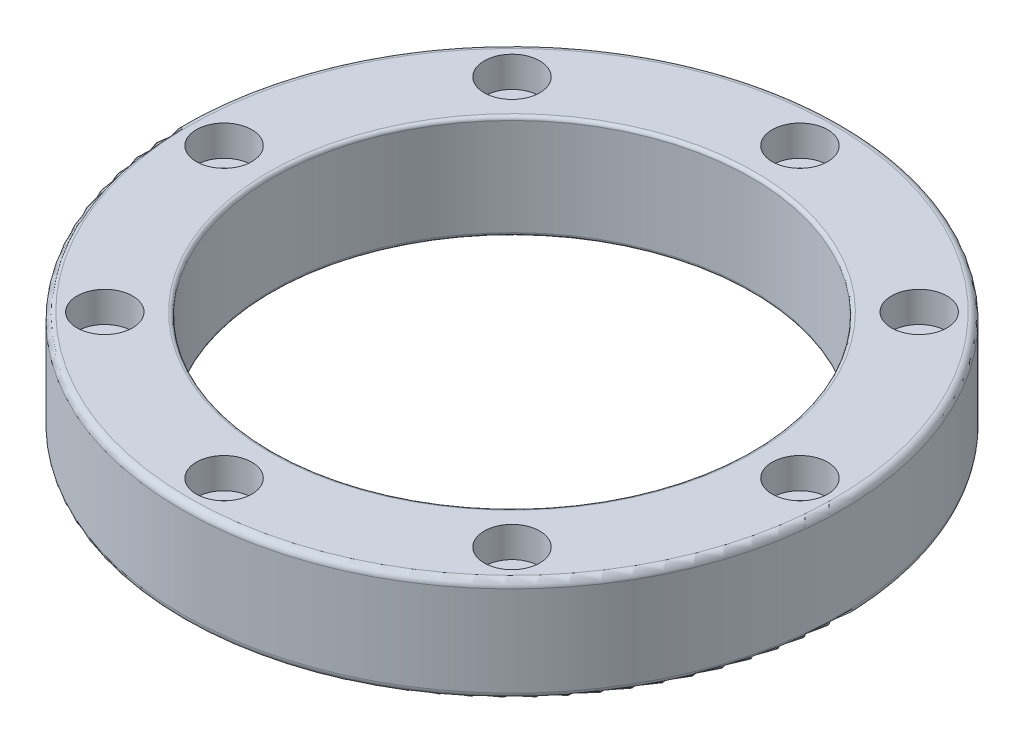
ISO-10303-21;
HEADER;
FILE_DESCRIPTION(('STEP AP214'),'2;1');
FILE_NAME('part.step','',(''),(''),'','','');
FILE_SCHEMA(('AUTOMOTIVE_DESIGN { 1 0 10303 214 1 1 1 1 }'));
ENDSEC;
DATA;
#1=APPLICATION_CONTEXT('core data for automotive mechanical design processes');
#2=APPLICATION_PROTOCOL_DEFINITION('international standard','automotive_design',2000,#1);
#3=PRODUCT_CONTEXT('',#1,'mechanical');
#4=PRODUCT('Part','Part','',(#3));
#5=PRODUCT_RELATED_PRODUCT_CATEGORY('part','',(#4));
#6=PRODUCT_DEFINITION_FORMATION('','',#4);
#7=PRODUCT_DEFINITION_CONTEXT('part definition',#1,'design');
#8=PRODUCT_DEFINITION('design','',#6,#7);
#9=PRODUCT_DEFINITION_SHAPE('','',#8);
#10=(LENGTH_UNIT() NAMED_UNIT(*) SI_UNIT(.MILLI.,.METRE.));
#11=(NAMED_UNIT(*) PLANE_ANGLE_UNIT() SI_UNIT($,.RADIAN.));
#12=(NAMED_UNIT(*) SI_UNIT($,.STERADIAN.) SOLID_ANGLE_UNIT());
#13=UNCERTAINTY_MEASURE_WITH_UNIT(LENGTH_MEASURE(1.E-05),#10,'distance_accuracy_value','');
#14=(GEOMETRIC_REPRESENTATION_CONTEXT(3) GLOBAL_UNCERTAINTY_ASSIGNED_CONTEXT((#13)) GLOBAL_UNIT_ASSIGNED_CONTEXT((#10,
#11,#12)) REPRESENTATION_CONTEXT('',''));
#15=CARTESIAN_POINT('',(0.,0.,0.));
#16=DIRECTION('',(0.,0.,1.));
#17=DIRECTION('',(1.,0.,0.));
#18=AXIS2_PLACEMENT_3D('',#15,#16,#17);
#19=CARTESIAN_POINT('',(-29.3449314192414,0.,-29.3449314192421));
#20=DIRECTION('',(0.,1.,0.));
#21=DIRECTION('',(0.,0.,1.));
#22=AXIS2_PLACEMENT_3D('',#19,#20,#21);
#23=CYLINDRICAL_SURFACE('',#22,2.25);
#24=CARTESIAN_POINT('',(-29.3449314192414,0.,-29.3449314192421));
#25=DIRECTION('',(0.,1.,0.));
#26=DIRECTION('',(0.,0.,1.));
#27=AXIS2_PLACEMENT_3D('',#24,#25,#26);
#28=CIRCLE('',#27,2.25);
#29=CARTESIAN_POINT('',(-29.3449314192414,0.,-27.0949314192421));
#30=VERTEX_POINT('',#29);
#31=EDGE_CURVE('E73',#30,#30,#28,.T.);
#32=ORIENTED_EDGE('',*,*,#31,.F.);
#33=EDGE_LOOP('',(#32));
#34=FACE_BOUND('',#33,.T.);
#35=CARTESIAN_POINT('',(-29.3449314192414,10.6,-29.3449314192421));
#36=DIRECTION('',(0.,1.,0.));
#37=DIRECTION('',(0.,0.,1.));
#38=AXIS2_PLACEMENT_3D('',#35,#36,#37);
#39=CIRCLE('',#38,2.25);
#40=CARTESIAN_POINT('',(-29.3449314192414,10.6,-27.0949314192421));
#41=VERTEX_POINT('',#40);
#42=EDGE_CURVE('E70',#41,#41,#39,.F.);
#43=ORIENTED_EDGE('',*,*,#42,.F.);
#44=EDGE_LOOP('',(#43));
#45=FACE_BOUND('',#44,.T.);
#46=ADVANCED_FACE('F37',(#34,#45),#23,.F.);
#47=CARTESIAN_POINT('',(-41.5,0.,-4.3468942668597E-13));
#48=DIRECTION('',(0.,1.,0.));
#49=DIRECTION('',(0.,0.,1.));
#50=AXIS2_PLACEMENT_3D('',#47,#48,#49);
#51=CYLINDRICAL_SURFACE('',#50,2.25);
#52=CARTESIAN_POINT('',(-41.5,0.,-4.3468942668597E-13));
#53=DIRECTION('',(0.,1.,0.));
#54=DIRECTION('',(0.,0.,1.));
#55=AXIS2_PLACEMENT_3D('',#52,#53,#54);
#56=CIRCLE('',#55,2.25);
#57=CARTESIAN_POINT('',(-41.5,0.,2.24999999999957));
#58=VERTEX_POINT('',#57);
#59=EDGE_CURVE('E98',#58,#58,#56,.T.);
#60=ORIENTED_EDGE('',*,*,#59,.F.);
#61=EDGE_LOOP('',(#60));
#62=FACE_BOUND('',#61,.T.);
#63=CARTESIAN_POINT('',(-41.5,10.6,-4.3468942668597E-13));
#64=DIRECTION('',(0.,1.,0.));
#65=DIRECTION('',(0.,0.,1.));
#66=AXIS2_PLACEMENT_3D('',#63,#64,#65);
#67=CIRCLE('',#66,2.25);
#68=CARTESIAN_POINT('',(-41.5,10.6,2.24999999999957));
#69=VERTEX_POINT('',#68);
#70=EDGE_CURVE('E74',#69,#69,#67,.F.);
#71=ORIENTED_EDGE('',*,*,#70,.F.);
#72=EDGE_LOOP('',(#71));
#73=FACE_BOUND('',#72,.T.);
#74=ADVANCED_FACE('F216',(#62,#73),#51,.F.);
#75=CARTESIAN_POINT('',(-29.344931419242,0.,29.3449314192415));
#76=DIRECTION('',(0.,1.,0.));
#77=DIRECTION('',(0.,0.,1.));
#78=AXIS2_PLACEMENT_3D('',#75,#76,#77);
#79=CYLINDRICAL_SURFACE('',#78,2.25);
#80=CARTESIAN_POINT('',(-29.344931419242,0.,29.3449314192415));
#81=DIRECTION('',(0.,1.,0.));
#82=DIRECTION('',(0.,0.,1.));
#83=AXIS2_PLACEMENT_3D('',#80,#81,#82);
#84=CIRCLE('',#83,2.25);
#85=CARTESIAN_POINT('',(-29.344931419242,0.,31.5949314192415));
#86=VERTEX_POINT('',#85);
#87=EDGE_CURVE('E101',#86,#86,#84,.T.);
#88=ORIENTED_EDGE('',*,*,#87,.F.);
#89=EDGE_LOOP('',(#88));
#90=FACE_BOUND('',#89,.T.);
#91=CARTESIAN_POINT('',(-29.344931419242,10.6,29.3449314192415));
#92=DIRECTION('',(0.,1.,0.));
#93=DIRECTION('',(0.,0.,1.));
#94=AXIS2_PLACEMENT_3D('',#91,#92,#93);
#95=CIRCLE('',#94,2.25);
#96=CARTESIAN_POINT('',(-29.344931419242,10.6,31.5949314192415));
#97=VERTEX_POINT('',#96);
#98=EDGE_CURVE('E77',#97,#97,#95,.F.);
#99=ORIENTED_EDGE('',*,*,#98,.F.);
#100=EDGE_LOOP('',(#99));
#101=FACE_BOUND('',#100,.T.);
#102=ADVANCED_FACE('F222',(#90,#101),#79,.F.);
#103=CARTESIAN_POINT('',(-2.8979295112398E-13,0.,41.5));
#104=DIRECTION('',(0.,1.,0.));
#105=DIRECTION('',(0.,0.,1.));
#106=AXIS2_PLACEMENT_3D('',#103,#104,#105);
#107=CYLINDRICAL_SURFACE('',#106,2.25);
#108=CARTESIAN_POINT('',(-2.8979295112398E-13,0.,41.5));
#109=DIRECTION('',(0.,1.,0.));
#110=DIRECTION('',(0.,0.,1.));
#111=AXIS2_PLACEMENT_3D('',#108,#109,#110);
#112=CIRCLE('',#111,2.25);
#113=CARTESIAN_POINT('',(-2.8979295112398E-13,0.,43.75));
#114=VERTEX_POINT('',#113);
#115=EDGE_CURVE('E104',#114,#114,#112,.T.);
#116=ORIENTED_EDGE('',*,*,#115,.F.);
#117=EDGE_LOOP('',(#116));
#118=FACE_BOUND('',#117,.T.);
#119=CARTESIAN_POINT('',(-2.8979295112398E-13,10.6,41.5));
#120=DIRECTION('',(0.,1.,0.));
#121=DIRECTION('',(0.,0.,1.));
#122=AXIS2_PLACEMENT_3D('',#119,#120,#121);
#123=CIRCLE('',#122,2.25);
#124=CARTESIAN_POINT('',(-2.8979295112398E-13,10.6,43.75));
#125=VERTEX_POINT('',#124);
#126=EDGE_CURVE('E80',#125,#125,#123,.F.);
#127=ORIENTED_EDGE('',*,*,#126,.F.);
#128=EDGE_LOOP('',(#127));
#129=FACE_BOUND('',#128,.T.);
#130=ADVANCED_FACE('F476',(#118,#129),#107,.F.);
#131=CARTESIAN_POINT('',(29.3449314192416,0.,29.3449314192419));
#132=DIRECTION('',(0.,1.,0.));
#133=DIRECTION('',(0.,0.,1.));
#134=AXIS2_PLACEMENT_3D('',#131,#132,#133);
#135=CYLINDRICAL_SURFACE('',#134,2.25);
#136=CARTESIAN_POINT('',(29.3449314192416,0.,29.3449314192419));
#137=DIRECTION('',(0.,1.,0.));
#138=DIRECTION('',(0.,0.,1.));
#139=AXIS2_PLACEMENT_3D('',#136,#137,#138);
#140=CIRCLE('',#139,2.25);
#141=CARTESIAN_POINT('',(29.3449314192416,0.,31.5949314192419));
#142=VERTEX_POINT('',#141);
#143=EDGE_CURVE('E107',#142,#142,#140,.T.);
#144=ORIENTED_EDGE('',*,*,#143,.F.);
#145=EDGE_LOOP('',(#144));
#146=FACE_BOUND('',#145,.T.);
#147=CARTESIAN_POINT('',(29.3449314192416,10.6,29.3449314192419));
#148=DIRECTION('',(0.,1.,0.));
#149=DIRECTION('',(0.,0.,1.));
#150=AXIS2_PLACEMENT_3D('',#147,#148,#149);
#151=CIRCLE('',#150,2.25);
#152=CARTESIAN_POINT('',(29.3449314192416,10.6,31.5949314192419));
#153=VERTEX_POINT('',#152);
#154=EDGE_CURVE('E83',#153,#153,#151,.F.);
#155=ORIENTED_EDGE('',*,*,#154,.F.);
#156=EDGE_LOOP('',(#155));
#157=FACE_BOUND('',#156,.T.);
#158=ADVANCED_FACE('F467',(#146,#157),#135,.F.);
#159=CARTESIAN_POINT('',(41.5,0.,1.4489647556199E-13));
#160=DIRECTION('',(0.,1.,0.));
#161=DIRECTION('',(0.,0.,1.));
#162=AXIS2_PLACEMENT_3D('',#159,#160,#161);
#163=CYLINDRICAL_SURFACE('',#162,2.25);
#164=CARTESIAN_POINT('',(41.5,0.,1.4489647556199E-13));
#165=DIRECTION('',(0.,1.,0.));
#166=DIRECTION('',(0.,0.,1.));
#167=AXIS2_PLACEMENT_3D('',#164,#165,#166);
#168=CIRCLE('',#167,2.25);
#169=CARTESIAN_POINT('',(41.5,0.,2.25000000000015));
#170=VERTEX_POINT('',#169);
#171=EDGE_CURVE('E110',#170,#170,#168,.T.);
#172=ORIENTED_EDGE('',*,*,#171,.F.);
#173=EDGE_LOOP('',(#172));
#174=FACE_BOUND('',#173,.T.);
#175=CARTESIAN_POINT('',(41.5,10.6,1.4489647556199E-13));
#176=DIRECTION('',(0.,1.,0.));
#177=DIRECTION('',(0.,0.,1.));
#178=AXIS2_PLACEMENT_3D('',#175,#176,#177);
#179=CIRCLE('',#178,2.25);
#180=CARTESIAN_POINT('',(41.5,10.6,2.25000000000015));
#181=VERTEX_POINT('',#180);
#182=EDGE_CURVE('E86',#181,#181,#179,.F.);
#183=ORIENTED_EDGE('',*,*,#182,.F.);
#184=EDGE_LOOP('',(#183));
#185=FACE_BOUND('',#184,.T.);
#186=ADVANCED_FACE('F458',(#174,#185),#163,.F.);
#187=CARTESIAN_POINT('',(29.3449314192418,0.,-29.3449314192417));
#188=DIRECTION('',(0.,1.,0.));
#189=DIRECTION('',(0.,0.,1.));
#190=AXIS2_PLACEMENT_3D('',#187,#188,#189);
#191=CYLINDRICAL_SURFACE('',#190,2.25);
#192=CARTESIAN_POINT('',(29.3449314192418,0.,-29.3449314192417));
#193=DIRECTION('',(0.,1.,0.));
#194=DIRECTION('',(0.,0.,1.));
#195=AXIS2_PLACEMENT_3D('',#192,#193,#194);
#196=CIRCLE('',#195,2.25);
#197=CARTESIAN_POINT('',(29.3449314192418,0.,-27.0949314192417));
#198=VERTEX_POINT('',#197);
#199=EDGE_CURVE('E113',#198,#198,#196,.T.);
#200=ORIENTED_EDGE('',*,*,#199,.F.);
#201=EDGE_LOOP('',(#200));
#202=FACE_BOUND('',#201,.T.);
#203=CARTESIAN_POINT('',(29.3449314192418,10.6,-29.3449314192417));
#204=DIRECTION('',(0.,1.,0.));
#205=DIRECTION('',(0.,0.,1.));
#206=AXIS2_PLACEMENT_3D('',#203,#204,#205);
#207=CIRCLE('',#206,2.25);
#208=CARTESIAN_POINT('',(29.3449314192418,10.6,-27.0949314192417));
#209=VERTEX_POINT('',#208);
#210=EDGE_CURVE('E89',#209,#209,#207,.F.);
#211=ORIENTED_EDGE('',*,*,#210,.F.);
#212=EDGE_LOOP('',(#211));
#213=FACE_BOUND('',#212,.T.);
#214=ADVANCED_FACE('F450',(#202,#213),#191,.F.);
#215=CARTESIAN_POINT('',(0.,0.,-41.5));
#216=DIRECTION('',(0.,1.,0.));
#217=DIRECTION('',(0.,0.,1.));
#218=AXIS2_PLACEMENT_3D('',#215,#216,#217);
#219=CYLINDRICAL_SURFACE('',#218,2.25);
#220=CARTESIAN_POINT('',(0.,0.,-41.5));
#221=DIRECTION('',(0.,1.,0.));
#222=DIRECTION('',(0.,0.,1.));
#223=AXIS2_PLACEMENT_3D('',#220,#221,#222);
#224=CIRCLE('',#223,2.25);
#225=CARTESIAN_POINT('',(0.,0.,-39.25));
#226=VERTEX_POINT('',#225);
#227=EDGE_CURVE('E69',#226,#226,#224,.T.);
#228=ORIENTED_EDGE('',*,*,#227,.F.);
#229=EDGE_LOOP('',(#228));
#230=FACE_BOUND('',#229,.T.);
#231=CARTESIAN_POINT('',(0.,10.6,-41.5));
#232=DIRECTION('',(0.,1.,0.));
#233=DIRECTION('',(0.,0.,1.));
#234=AXIS2_PLACEMENT_3D('',#231,#232,#233);
#235=CIRCLE('',#234,2.25);
#236=CARTESIAN_POINT('',(0.,10.6,-39.25));
#237=VERTEX_POINT('',#236);
#238=EDGE_CURVE('E92',#237,#237,#235,.F.);
#239=ORIENTED_EDGE('',*,*,#238,.F.);
#240=EDGE_LOOP('',(#239));
#241=FACE_BOUND('',#240,.T.);
#242=ADVANCED_FACE('F180',(#230,#241),#219,.F.);
#243=CARTESIAN_POINT('',(0.,15.,0.));
#244=DIRECTION('',(0.,1.,0.));
#245=DIRECTION('',(0.,0.,1.));
#246=AXIS2_PLACEMENT_3D('',#243,#244,#245);
#247=PLANE('',#246);
#248=CARTESIAN_POINT('',(0.,15.,0.));
#249=DIRECTION('',(0.,1.,0.));
#250=DIRECTION('',(0.,0.,1.));
#251=AXIS2_PLACEMENT_3D('',#248,#249,#250);
#252=CIRCLE('',#251,35.);
#253=CARTESIAN_POINT('',(0.,15.,35.));
#254=VERTEX_POINT('',#253);
#255=EDGE_CURVE('E10',#254,#254,#252,.F.);
#256=ORIENTED_EDGE('',*,*,#255,.T.);
#257=EDGE_LOOP('',(#256));
#258=FACE_BOUND('',#257,.T.);
#259=CARTESIAN_POINT('',(0.,15.,0.));
#260=DIRECTION('',(0.,1.,0.));
#261=DIRECTION('',(0.,0.,1.));
#262=AXIS2_PLACEMENT_3D('',#259,#260,#261);
#263=CIRCLE('',#262,46.5);
#264=CARTESIAN_POINT('',(0.,15.,46.5));
#265=VERTEX_POINT('',#264);
#266=EDGE_CURVE('E57',#265,#265,#263,.T.);
#267=ORIENTED_EDGE('',*,*,#266,.T.);
#268=EDGE_LOOP('',(#267));
#269=FACE_BOUND('',#268,.T.);
#270=CARTESIAN_POINT('',(0.,15.,-41.5));
#271=DIRECTION('',(0.,1.,0.));
#272=DIRECTION('',(0.,0.,1.));
#273=AXIS2_PLACEMENT_3D('',#270,#271,#272);
#274=CIRCLE('',#273,4.);
#275=CARTESIAN_POINT('',(0.,15.,-37.5));
#276=VERTEX_POINT('',#275);
#277=EDGE_CURVE('E160',#276,#276,#274,.T.);
#278=ORIENTED_EDGE('',*,*,#277,.F.);
#279=EDGE_LOOP('',(#278));
#280=FACE_BOUND('',#279,.T.);
#281=CARTESIAN_POINT('',(29.3449314192418,15.,-29.3449314192417));
#282=DIRECTION('',(0.,1.,0.));
#283=DIRECTION('',(0.,0.,1.));
#284=AXIS2_PLACEMENT_3D('',#281,#282,#283);
#285=CIRCLE('',#284,4.);
#286=CARTESIAN_POINT('',(29.3449314192418,15.,-25.3449314192417));
#287=VERTEX_POINT('',#286);
#288=EDGE_CURVE('E157',#287,#287,#285,.T.);
#289=ORIENTED_EDGE('',*,*,#288,.F.);
#290=EDGE_LOOP('',(#289));
#291=FACE_BOUND('',#290,.T.);
#292=CARTESIAN_POINT('',(41.5,15.,1.4489647556199E-13));
#293=DIRECTION('',(0.,1.,0.));
#294=DIRECTION('',(0.,0.,1.));
#295=AXIS2_PLACEMENT_3D('',#292,#293,#294);
#296=CIRCLE('',#295,4.);
#297=CARTESIAN_POINT('',(41.5,15.,4.00000000000015));
#298=VERTEX_POINT('',#297);
#299=EDGE_CURVE('E151',#298,#298,#296,.T.);
#300=ORIENTED_EDGE('',*,*,#299,.F.);
#301=EDGE_LOOP('',(#300));
#302=FACE_BOUND('',#301,.T.);
#303=CARTESIAN_POINT('',(29.3449314192416,15.,29.3449314192419));
#304=DIRECTION('',(0.,1.,0.));
#305=DIRECTION('',(0.,0.,1.));
#306=AXIS2_PLACEMENT_3D('',#303,#304,#305);
#307=CIRCLE('',#306,4.00000000000001);
#308=CARTESIAN_POINT('',(29.3449314192416,15.,33.3449314192419));
#309=VERTEX_POINT('',#308);
#310=EDGE_CURVE('E145',#309,#309,#307,.T.);
#311=ORIENTED_EDGE('',*,*,#310,.F.);
#312=EDGE_LOOP('',(#311));
#313=FACE_BOUND('',#312,.T.);
#314=CARTESIAN_POINT('',(-2.8979295112398E-13,15.,41.5));
#315=DIRECTION('',(0.,1.,0.));
#316=DIRECTION('',(0.,0.,1.));
#317=AXIS2_PLACEMENT_3D('',#314,#315,#316);
#318=CIRCLE('',#317,4.);
#319=CARTESIAN_POINT('',(-2.8979295112398E-13,15.,45.5));
#320=VERTEX_POINT('',#319);
#321=EDGE_CURVE('E139',#320,#320,#318,.T.);
#322=ORIENTED_EDGE('',*,*,#321,.F.);
#323=EDGE_LOOP('',(#322));
#324=FACE_BOUND('',#323,.T.);
#325=CARTESIAN_POINT('',(-29.344931419242,15.,29.3449314192415));
#326=DIRECTION('',(0.,1.,0.));
#327=DIRECTION('',(0.,0.,1.));
#328=AXIS2_PLACEMENT_3D('',#325,#326,#327);
#329=CIRCLE('',#328,4.);
#330=CARTESIAN_POINT('',(-29.344931419242,15.,33.3449314192415));
#331=VERTEX_POINT('',#330);
#332=EDGE_CURVE('E133',#331,#331,#329,.T.);
#333=ORIENTED_EDGE('',*,*,#332,.F.);
#334=EDGE_LOOP('',(#333));
#335=FACE_BOUND('',#334,.T.);
#336=CARTESIAN_POINT('',(-41.5,15.,-4.3468942668597E-13));
#337=DIRECTION('',(0.,1.,0.));
#338=DIRECTION('',(0.,0.,1.));
#339=AXIS2_PLACEMENT_3D('',#336,#337,#338);
#340=CIRCLE('',#339,4.);
#341=CARTESIAN_POINT('',(-41.5,15.,3.99999999999957));
#342=VERTEX_POINT('',#341);
#343=EDGE_CURVE('E127',#342,#342,#340,.T.);
#344=ORIENTED_EDGE('',*,*,#343,.F.);
#345=EDGE_LOOP('',(#344));
#346=FACE_BOUND('',#345,.T.);
#347=CARTESIAN_POINT('',(-29.3449314192414,15.,-29.3449314192421));
#348=DIRECTION('',(0.,1.,0.));
#349=DIRECTION('',(0.,0.,1.));
#350=AXIS2_PLACEMENT_3D('',#347,#348,#349);
#351=CIRCLE('',#350,4.);
#352=CARTESIAN_POINT('',(-29.3449314192414,15.,-25.3449314192421));
#353=VERTEX_POINT('',#352);
#354=EDGE_CURVE('E121',#353,#353,#351,.T.);
#355=ORIENTED_EDGE('',*,*,#354,.F.);
#356=EDGE_LOOP('',(#355));
#357=FACE_BOUND('',#356,.T.);
#358=ADVANCED_FACE('F176',(#258,#269,#280,#291,#302,#313,#324,#335,#346,#357),#247,.T.);
#359=CARTESIAN_POINT('',(0.,0.,0.));
#360=DIRECTION('',(0.,1.,0.));
#361=DIRECTION('',(0.,0.,1.));
#362=AXIS2_PLACEMENT_3D('',#359,#360,#361);
#363=PLANE('',#362);
#364=CARTESIAN_POINT('',(0.,0.,0.));
#365=DIRECTION('',(0.,1.,0.));
#366=DIRECTION('',(0.,0.,1.));
#367=AXIS2_PLACEMENT_3D('',#364,#365,#366);
#368=CIRCLE('',#367,35.);
#369=CARTESIAN_POINT('',(0.,0.,35.));
#370=VERTEX_POINT('',#369);
#371=EDGE_CURVE('E52',#370,#370,#368,.T.);
#372=ORIENTED_EDGE('',*,*,#371,.T.);
#373=EDGE_LOOP('',(#372));
#374=FACE_BOUND('',#373,.T.);
#375=CARTESIAN_POINT('',(0.,0.,0.));
#376=DIRECTION('',(0.,1.,0.));
#377=DIRECTION('',(0.,0.,1.));
#378=AXIS2_PLACEMENT_3D('',#375,#376,#377);
#379=CIRCLE('',#378,46.5);
#380=CARTESIAN_POINT('',(0.,0.,46.5));
#381=VERTEX_POINT('',#380);
#382=EDGE_CURVE('E60',#381,#381,#379,.F.);
#383=ORIENTED_EDGE('',*,*,#382,.T.);
#384=EDGE_LOOP('',(#383));
#385=FACE_BOUND('',#384,.T.);
#386=ORIENTED_EDGE('',*,*,#227,.T.);
#387=EDGE_LOOP('',(#386));
#388=FACE_BOUND('',#387,.T.);
#389=ORIENTED_EDGE('',*,*,#199,.T.);
#390=EDGE_LOOP('',(#389));
#391=FACE_BOUND('',#390,.T.);
#392=ORIENTED_EDGE('',*,*,#171,.T.);
#393=EDGE_LOOP('',(#392));
#394=FACE_BOUND('',#393,.T.);
#395=ORIENTED_EDGE('',*,*,#143,.T.);
#396=EDGE_LOOP('',(#395));
#397=FACE_BOUND('',#396,.T.);
#398=ORIENTED_EDGE('',*,*,#115,.T.);
#399=EDGE_LOOP('',(#398));
#400=FACE_BOUND('',#399,.T.);
#401=ORIENTED_EDGE('',*,*,#87,.T.);
#402=EDGE_LOOP('',(#401));
#403=FACE_BOUND('',#402,.T.);
#404=ORIENTED_EDGE('',*,*,#59,.T.);
#405=EDGE_LOOP('',(#404));
#406=FACE_BOUND('',#405,.T.);
#407=ORIENTED_EDGE('',*,*,#31,.T.);
#408=EDGE_LOOP('',(#407));
#409=FACE_BOUND('',#408,.T.);
#410=ADVANCED_FACE('F179',(#374,#385,#388,#391,#394,#397,#400,#403,#406,#409),#363,.F.);
#411=CARTESIAN_POINT('',(0.,15.,0.));
#412=DIRECTION('',(0.,-1.,0.));
#413=DIRECTION('',(0.,0.,-1.));
#414=AXIS2_PLACEMENT_3D('',#411,#412,#413);
#415=CYLINDRICAL_SURFACE('',#414,47.5);
#416=CARTESIAN_POINT('',(0.,1.,0.));
#417=DIRECTION('',(0.,1.,0.));
#418=DIRECTION('',(0.,0.,1.));
#419=AXIS2_PLACEMENT_3D('',#416,#417,#418);
#420=CIRCLE('',#419,47.5);
#421=CARTESIAN_POINT('',(0.,1.,47.5));
#422=VERTEX_POINT('',#421);
#423=EDGE_CURVE('E63',#422,#422,#420,.T.);
#424=ORIENTED_EDGE('',*,*,#423,.T.);
#425=EDGE_LOOP('',(#424));
#426=FACE_BOUND('',#425,.T.);
#427=CARTESIAN_POINT('',(0.,14.,0.));
#428=DIRECTION('',(0.,1.,0.));
#429=DIRECTION('',(0.,0.,1.));
#430=AXIS2_PLACEMENT_3D('',#427,#428,#429);
#431=CIRCLE('',#430,47.5);
#432=CARTESIAN_POINT('',(0.,14.,47.5));
#433=VERTEX_POINT('',#432);
#434=EDGE_CURVE('E66',#433,#433,#431,.F.);
#435=ORIENTED_EDGE('',*,*,#434,.T.);
#436=EDGE_LOOP('',(#435));
#437=FACE_BOUND('',#436,.T.);
#438=ADVANCED_FACE('F231',(#426,#437),#415,.T.);
#439=CARTESIAN_POINT('',(0.,15.,0.));
#440=DIRECTION('',(0.,-1.,0.));
#441=DIRECTION('',(0.,0.,-1.));
#442=AXIS2_PLACEMENT_3D('',#439,#440,#441);
#443=CYLINDRICAL_SURFACE('',#442,34.5);
#444=CARTESIAN_POINT('',(0.,0.5,0.));
#445=DIRECTION('',(0.,1.,0.));
#446=DIRECTION('',(0.,0.,1.));
#447=AXIS2_PLACEMENT_3D('',#444,#445,#446);
#448=CIRCLE('',#447,34.5);
#449=CARTESIAN_POINT('',(0.,0.5,34.5));
#450=VERTEX_POINT('',#449);
#451=EDGE_CURVE('E44',#450,#450,#448,.F.);
#452=ORIENTED_EDGE('',*,*,#451,.T.);
#453=EDGE_LOOP('',(#452));
#454=FACE_BOUND('',#453,.T.);
#455=CARTESIAN_POINT('',(0.,14.5,0.));
#456=DIRECTION('',(0.,1.,0.));
#457=DIRECTION('',(0.,0.,1.));
#458=AXIS2_PLACEMENT_3D('',#455,#456,#457);
#459=CIRCLE('',#458,34.5);
#460=CARTESIAN_POINT('',(0.,14.5,34.5));
#461=VERTEX_POINT('',#460);
#462=EDGE_CURVE('E48',#461,#461,#459,.T.);
#463=ORIENTED_EDGE('',*,*,#462,.T.);
#464=EDGE_LOOP('',(#463));
#465=FACE_BOUND('',#464,.T.);
#466=ADVANCED_FACE('F229',(#454,#465),#443,.F.);
#467=CARTESIAN_POINT('',(0.,10.6,-41.5));
#468=DIRECTION('',(0.,1.,0.));
#469=DIRECTION('',(0.,0.,1.));
#470=AXIS2_PLACEMENT_3D('',#467,#468,#469);
#471=PLANE('',#470);
#472=CARTESIAN_POINT('',(0.,10.6,-41.5));
#473=DIRECTION('',(0.,1.,0.));
#474=DIRECTION('',(0.,0.,1.));
#475=AXIS2_PLACEMENT_3D('',#472,#473,#474);
#476=CIRCLE('',#475,4.);
#477=CARTESIAN_POINT('',(0.,10.6,-37.5));
#478=VERTEX_POINT('',#477);
#479=EDGE_CURVE('E95',#478,#478,#476,.T.);
#480=ORIENTED_EDGE('',*,*,#479,.T.);
#481=EDGE_LOOP('',(#480));
#482=FACE_BOUND('',#481,.T.);
#483=ORIENTED_EDGE('',*,*,#238,.T.);
#484=EDGE_LOOP('',(#483));
#485=FACE_BOUND('',#484,.T.);
#486=ADVANCED_FACE('F166',(#482,#485),#471,.T.);
#487=CARTESIAN_POINT('',(0.,10.6,-41.5));
#488=DIRECTION('',(0.,1.,0.));
#489=DIRECTION('',(0.,0.,1.));
#490=AXIS2_PLACEMENT_3D('',#487,#488,#489);
#491=CYLINDRICAL_SURFACE('',#490,4.);
#492=ORIENTED_EDGE('',*,*,#479,.F.);
#493=EDGE_LOOP('',(#492));
#494=FACE_BOUND('',#493,.T.);
#495=ORIENTED_EDGE('',*,*,#277,.T.);
#496=EDGE_LOOP('',(#495));
#497=FACE_BOUND('',#496,.T.);
#498=ADVANCED_FACE('F169',(#494,#497),#491,.F.);
#499=CARTESIAN_POINT('',(29.3449314192418,10.6,-29.3449314192417));
#500=DIRECTION('',(0.,1.,0.));
#501=DIRECTION('',(0.,0.,1.));
#502=AXIS2_PLACEMENT_3D('',#499,#500,#501);
#503=PLANE('',#502);
#504=CARTESIAN_POINT('',(29.3449314192418,10.6,-29.3449314192417));
#505=DIRECTION('',(0.,1.,0.));
#506=DIRECTION('',(0.,0.,1.));
#507=AXIS2_PLACEMENT_3D('',#504,#505,#506);
#508=CIRCLE('',#507,4.);
#509=CARTESIAN_POINT('',(29.3449314192418,10.6,-25.3449314192417));
#510=VERTEX_POINT('',#509);
#511=EDGE_CURVE('E154',#510,#510,#508,.T.);
#512=ORIENTED_EDGE('',*,*,#511,.T.);
#513=EDGE_LOOP('',(#512));
#514=FACE_BOUND('',#513,.T.);
#515=ORIENTED_EDGE('',*,*,#210,.T.);
#516=EDGE_LOOP('',(#515));
#517=FACE_BOUND('',#516,.T.);
#518=ADVANCED_FACE('F172',(#514,#517),#503,.T.);
#519=CARTESIAN_POINT('',(29.3449314192418,10.6,-29.3449314192417));
#520=DIRECTION('',(0.,1.,0.));
#521=DIRECTION('',(0.,0.,1.));
#522=AXIS2_PLACEMENT_3D('',#519,#520,#521);
#523=CYLINDRICAL_SURFACE('',#522,4.);
#524=ORIENTED_EDGE('',*,*,#511,.F.);
#525=EDGE_LOOP('',(#524));
#526=FACE_BOUND('',#525,.T.);
#527=ORIENTED_EDGE('',*,*,#288,.T.);
#528=EDGE_LOOP('',(#527));
#529=FACE_BOUND('',#528,.T.);
#530=ADVANCED_FACE('F306',(#526,#529),#523,.F.);
#531=CARTESIAN_POINT('',(41.5,10.6,1.4489647556199E-13));
#532=DIRECTION('',(0.,1.,0.));
#533=DIRECTION('',(0.,0.,1.));
#534=AXIS2_PLACEMENT_3D('',#531,#532,#533);
#535=PLANE('',#534);
#536=CARTESIAN_POINT('',(41.5,10.6,1.4489647556199E-13));
#537=DIRECTION('',(0.,1.,0.));
#538=DIRECTION('',(0.,0.,1.));
#539=AXIS2_PLACEMENT_3D('',#536,#537,#538);
#540=CIRCLE('',#539,4.);
#541=CARTESIAN_POINT('',(41.5,10.6,4.00000000000015));
#542=VERTEX_POINT('',#541);
#543=EDGE_CURVE('E148',#542,#542,#540,.T.);
#544=ORIENTED_EDGE('',*,*,#543,.T.);
#545=EDGE_LOOP('',(#544));
#546=FACE_BOUND('',#545,.T.);
#547=ORIENTED_EDGE('',*,*,#182,.T.);
#548=EDGE_LOOP('',(#547));
#549=FACE_BOUND('',#548,.T.);
#550=ADVANCED_FACE('F303',(#546,#549),#535,.T.);
#551=CARTESIAN_POINT('',(41.5,10.6,1.4489647556199E-13));
#552=DIRECTION('',(0.,1.,0.));
#553=DIRECTION('',(0.,0.,1.));
#554=AXIS2_PLACEMENT_3D('',#551,#552,#553);
#555=CYLINDRICAL_SURFACE('',#554,4.);
#556=ORIENTED_EDGE('',*,*,#543,.F.);
#557=EDGE_LOOP('',(#556));
#558=FACE_BOUND('',#557,.T.);
#559=ORIENTED_EDGE('',*,*,#299,.T.);
#560=EDGE_LOOP('',(#559));
#561=FACE_BOUND('',#560,.T.);
#562=ADVANCED_FACE('F298',(#558,#561),#555,.F.);
#563=CARTESIAN_POINT('',(29.3449314192416,10.6,29.3449314192419));
#564=DIRECTION('',(0.,1.,0.));
#565=DIRECTION('',(0.,0.,1.));
#566=AXIS2_PLACEMENT_3D('',#563,#564,#565);
#567=PLANE('',#566);
#568=CARTESIAN_POINT('',(29.3449314192416,10.6,29.3449314192419));
#569=DIRECTION('',(0.,1.,0.));
#570=DIRECTION('',(0.,0.,1.));
#571=AXIS2_PLACEMENT_3D('',#568,#569,#570);
#572=CIRCLE('',#571,4.00000000000001);
#573=CARTESIAN_POINT('',(29.3449314192416,10.6,33.3449314192419));
#574=VERTEX_POINT('',#573);
#575=EDGE_CURVE('E142',#574,#574,#572,.T.);
#576=ORIENTED_EDGE('',*,*,#575,.T.);
#577=EDGE_LOOP('',(#576));
#578=FACE_BOUND('',#577,.T.);
#579=ORIENTED_EDGE('',*,*,#154,.T.);
#580=EDGE_LOOP('',(#579));
#581=FACE_BOUND('',#580,.T.);
#582=ADVANCED_FACE('F295',(#578,#581),#567,.T.);
#583=CARTESIAN_POINT('',(29.3449314192416,10.6,29.3449314192419));
#584=DIRECTION('',(0.,1.,0.));
#585=DIRECTION('',(0.,0.,1.));
#586=AXIS2_PLACEMENT_3D('',#583,#584,#585);
#587=CYLINDRICAL_SURFACE('',#586,4.00000000000001);
#588=ORIENTED_EDGE('',*,*,#575,.F.);
#589=EDGE_LOOP('',(#588));
#590=FACE_BOUND('',#589,.T.);
#591=ORIENTED_EDGE('',*,*,#310,.T.);
#592=EDGE_LOOP('',(#591));
#593=FACE_BOUND('',#592,.T.);
#594=ADVANCED_FACE('F290',(#590,#593),#587,.F.);
#595=CARTESIAN_POINT('',(-2.8979295112398E-13,10.6,41.5));
#596=DIRECTION('',(0.,1.,0.));
#597=DIRECTION('',(0.,0.,1.));
#598=AXIS2_PLACEMENT_3D('',#595,#596,#597);
#599=PLANE('',#598);
#600=CARTESIAN_POINT('',(-2.8979295112398E-13,10.6,41.5));
#601=DIRECTION('',(0.,1.,0.));
#602=DIRECTION('',(0.,0.,1.));
#603=AXIS2_PLACEMENT_3D('',#600,#601,#602);
#604=CIRCLE('',#603,4.);
#605=CARTESIAN_POINT('',(-2.8979295112398E-13,10.6,45.5));
#606=VERTEX_POINT('',#605);
#607=EDGE_CURVE('E136',#606,#606,#604,.T.);
#608=ORIENTED_EDGE('',*,*,#607,.T.);
#609=EDGE_LOOP('',(#608));
#610=FACE_BOUND('',#609,.T.);
#611=ORIENTED_EDGE('',*,*,#126,.T.);
#612=EDGE_LOOP('',(#611));
#613=FACE_BOUND('',#612,.T.);
#614=ADVANCED_FACE('F287',(#610,#613),#599,.T.);
#615=CARTESIAN_POINT('',(-2.8979295112398E-13,10.6,41.5));
#616=DIRECTION('',(0.,1.,0.));
#617=DIRECTION('',(0.,0.,1.));
#618=AXIS2_PLACEMENT_3D('',#615,#616,#617);
#619=CYLINDRICAL_SURFACE('',#618,4.);
#620=ORIENTED_EDGE('',*,*,#607,.F.);
#621=EDGE_LOOP('',(#620));
#622=FACE_BOUND('',#621,.T.);
#623=ORIENTED_EDGE('',*,*,#321,.T.);
#624=EDGE_LOOP('',(#623));
#625=FACE_BOUND('',#624,.T.);
#626=ADVANCED_FACE('F284',(#622,#625),#619,.F.);
#627=CARTESIAN_POINT('',(-29.344931419242,10.6,29.3449314192415));
#628=DIRECTION('',(0.,1.,0.));
#629=DIRECTION('',(0.,0.,1.));
#630=AXIS2_PLACEMENT_3D('',#627,#628,#629);
#631=PLANE('',#630);
#632=CARTESIAN_POINT('',(-29.344931419242,10.6,29.3449314192415));
#633=DIRECTION('',(0.,1.,0.));
#634=DIRECTION('',(0.,0.,1.));
#635=AXIS2_PLACEMENT_3D('',#632,#633,#634);
#636=CIRCLE('',#635,4.);
#637=CARTESIAN_POINT('',(-29.344931419242,10.6,33.3449314192415));
#638=VERTEX_POINT('',#637);
#639=EDGE_CURVE('E130',#638,#638,#636,.T.);
#640=ORIENTED_EDGE('',*,*,#639,.T.);
#641=EDGE_LOOP('',(#640));
#642=FACE_BOUND('',#641,.T.);
#643=ORIENTED_EDGE('',*,*,#98,.T.);
#644=EDGE_LOOP('',(#643));
#645=FACE_BOUND('',#644,.T.);
#646=ADVANCED_FACE('F279',(#642,#645),#631,.T.);
#647=CARTESIAN_POINT('',(-29.344931419242,10.6,29.3449314192415));
#648=DIRECTION('',(0.,1.,0.));
#649=DIRECTION('',(0.,0.,1.));
#650=AXIS2_PLACEMENT_3D('',#647,#648,#649);
#651=CYLINDRICAL_SURFACE('',#650,4.);
#652=ORIENTED_EDGE('',*,*,#639,.F.);
#653=EDGE_LOOP('',(#652));
#654=FACE_BOUND('',#653,.T.);
#655=ORIENTED_EDGE('',*,*,#332,.T.);
#656=EDGE_LOOP('',(#655));
#657=FACE_BOUND('',#656,.T.);
#658=ADVANCED_FACE('F271',(#654,#657),#651,.F.);
#659=CARTESIAN_POINT('',(-41.5,10.6,-4.3468942668597E-13));
#660=DIRECTION('',(0.,1.,0.));
#661=DIRECTION('',(0.,0.,1.));
#662=AXIS2_PLACEMENT_3D('',#659,#660,#661);
#663=PLANE('',#662);
#664=CARTESIAN_POINT('',(-41.5,10.6,-4.3468942668597E-13));
#665=DIRECTION('',(0.,1.,0.));
#666=DIRECTION('',(0.,0.,1.));
#667=AXIS2_PLACEMENT_3D('',#664,#665,#666);
#668=CIRCLE('',#667,4.);
#669=CARTESIAN_POINT('',(-41.5,10.6,3.99999999999957));
#670=VERTEX_POINT('',#669);
#671=EDGE_CURVE('E124',#670,#670,#668,.T.);
#672=ORIENTED_EDGE('',*,*,#671,.T.);
#673=EDGE_LOOP('',(#672));
#674=FACE_BOUND('',#673,.T.);
#675=ORIENTED_EDGE('',*,*,#70,.T.);
#676=EDGE_LOOP('',(#675));
#677=FACE_BOUND('',#676,.T.);
#678=ADVANCED_FACE('F269',(#674,#677),#663,.T.);
#679=CARTESIAN_POINT('',(-41.5,10.6,-4.3468942668597E-13));
#680=DIRECTION('',(0.,1.,0.));
#681=DIRECTION('',(0.,0.,1.));
#682=AXIS2_PLACEMENT_3D('',#679,#680,#681);
#683=CYLINDRICAL_SURFACE('',#682,4.);
#684=ORIENTED_EDGE('',*,*,#671,.F.);
#685=EDGE_LOOP('',(#684));
#686=FACE_BOUND('',#685,.T.);
#687=ORIENTED_EDGE('',*,*,#343,.T.);
#688=EDGE_LOOP('',(#687));
#689=FACE_BOUND('',#688,.T.);
#690=ADVANCED_FACE('F210',(#686,#689),#683,.F.);
#691=CARTESIAN_POINT('',(-29.3449314192414,10.6,-29.3449314192421));
#692=DIRECTION('',(0.,1.,0.));
#693=DIRECTION('',(0.,0.,1.));
#694=AXIS2_PLACEMENT_3D('',#691,#692,#693);
#695=PLANE('',#694);
#696=CARTESIAN_POINT('',(-29.3449314192414,10.6,-29.3449314192421));
#697=DIRECTION('',(0.,1.,0.));
#698=DIRECTION('',(0.,0.,1.));
#699=AXIS2_PLACEMENT_3D('',#696,#697,#698);
#700=CIRCLE('',#699,4.);
#701=CARTESIAN_POINT('',(-29.3449314192414,10.6,-25.3449314192421));
#702=VERTEX_POINT('',#701);
#703=EDGE_CURVE('E118',#702,#702,#700,.T.);
#704=ORIENTED_EDGE('',*,*,#703,.T.);
#705=EDGE_LOOP('',(#704));
#706=FACE_BOUND('',#705,.T.);
#707=ORIENTED_EDGE('',*,*,#42,.T.);
#708=EDGE_LOOP('',(#707));
#709=FACE_BOUND('',#708,.T.);
#710=ADVANCED_FACE('F199',(#706,#709),#695,.T.);
#711=CARTESIAN_POINT('',(-29.3449314192414,10.6,-29.3449314192421));
#712=DIRECTION('',(0.,1.,0.));
#713=DIRECTION('',(0.,0.,1.));
#714=AXIS2_PLACEMENT_3D('',#711,#712,#713);
#715=CYLINDRICAL_SURFACE('',#714,4.);
#716=ORIENTED_EDGE('',*,*,#703,.F.);
#717=EDGE_LOOP('',(#716));
#718=FACE_BOUND('',#717,.T.);
#719=ORIENTED_EDGE('',*,*,#354,.T.);
#720=EDGE_LOOP('',(#719));
#721=FACE_BOUND('',#720,.T.);
#722=ADVANCED_FACE('F196',(#718,#721),#715,.F.);
#723=CARTESIAN_POINT('',(0.,1.,0.));
#724=DIRECTION('',(0.,1.,0.));
#725=DIRECTION('',(0.,0.,1.));
#726=AXIS2_PLACEMENT_3D('',#723,#724,#725);
#727=TOROIDAL_SURFACE('',#726,46.5,1.);
#728=ORIENTED_EDGE('',*,*,#382,.F.);
#729=EDGE_LOOP('',(#728));
#730=FACE_BOUND('',#729,.T.);
#731=ORIENTED_EDGE('',*,*,#423,.F.);
#732=EDGE_LOOP('',(#731));
#733=FACE_BOUND('',#732,.T.);
#734=ADVANCED_FACE('F198',(#730,#733),#727,.T.);
#735=CARTESIAN_POINT('',(0.,14.,0.));
#736=DIRECTION('',(0.,1.,0.));
#737=DIRECTION('',(0.,0.,1.));
#738=AXIS2_PLACEMENT_3D('',#735,#736,#737);
#739=TOROIDAL_SURFACE('',#738,46.5,1.);
#740=ORIENTED_EDGE('',*,*,#434,.F.);
#741=EDGE_LOOP('',(#740));
#742=FACE_BOUND('',#741,.T.);
#743=ORIENTED_EDGE('',*,*,#266,.F.);
#744=EDGE_LOOP('',(#743));
#745=FACE_BOUND('',#744,.T.);
#746=ADVANCED_FACE('F207',(#742,#745),#739,.T.);
#747=CARTESIAN_POINT('',(0.,0.5,0.));
#748=DIRECTION('',(0.,1.,0.));
#749=DIRECTION('',(0.,0.,1.));
#750=AXIS2_PLACEMENT_3D('',#747,#748,#749);
#751=TOROIDAL_SURFACE('',#750,35.,0.5);
#752=ORIENTED_EDGE('',*,*,#451,.F.);
#753=EDGE_LOOP('',(#752));
#754=FACE_BOUND('',#753,.T.);
#755=ORIENTED_EDGE('',*,*,#371,.F.);
#756=EDGE_LOOP('',(#755));
#757=FACE_BOUND('',#756,.T.);
#758=ADVANCED_FACE('F239',(#754,#757),#751,.T.);
#759=CARTESIAN_POINT('',(0.,14.5,0.));
#760=DIRECTION('',(0.,1.,0.));
#761=DIRECTION('',(0.,0.,1.));
#762=AXIS2_PLACEMENT_3D('',#759,#760,#761);
#763=TOROIDAL_SURFACE('',#762,35.,0.5);
#764=ORIENTED_EDGE('',*,*,#255,.F.);
#765=EDGE_LOOP('',(#764));
#766=FACE_BOUND('',#765,.T.);
#767=ORIENTED_EDGE('',*,*,#462,.F.);
#768=EDGE_LOOP('',(#767));
#769=FACE_BOUND('',#768,.T.);
#770=ADVANCED_FACE('F39',(#766,#769),#763,.T.);
#771=CLOSED_SHELL('',(#46,#74,#102,#130,#158,#186,#214,#242,#358,#410,#438,#466,#486,#498,#518,
#530,#550,#562,#582,#594,#614,#626,#646,#658,#678,#690,#710,#722,#734,#746,#758,#770));
#772=MANIFOLD_SOLID_BREP('B2',#771);
#773=ADVANCED_BREP_SHAPE_REPRESENTATION('',(#18,#772),#14);
#774=SHAPE_DEFINITION_REPRESENTATION(#9,#773);
ENDSEC;
END-ISO-10303-21;
